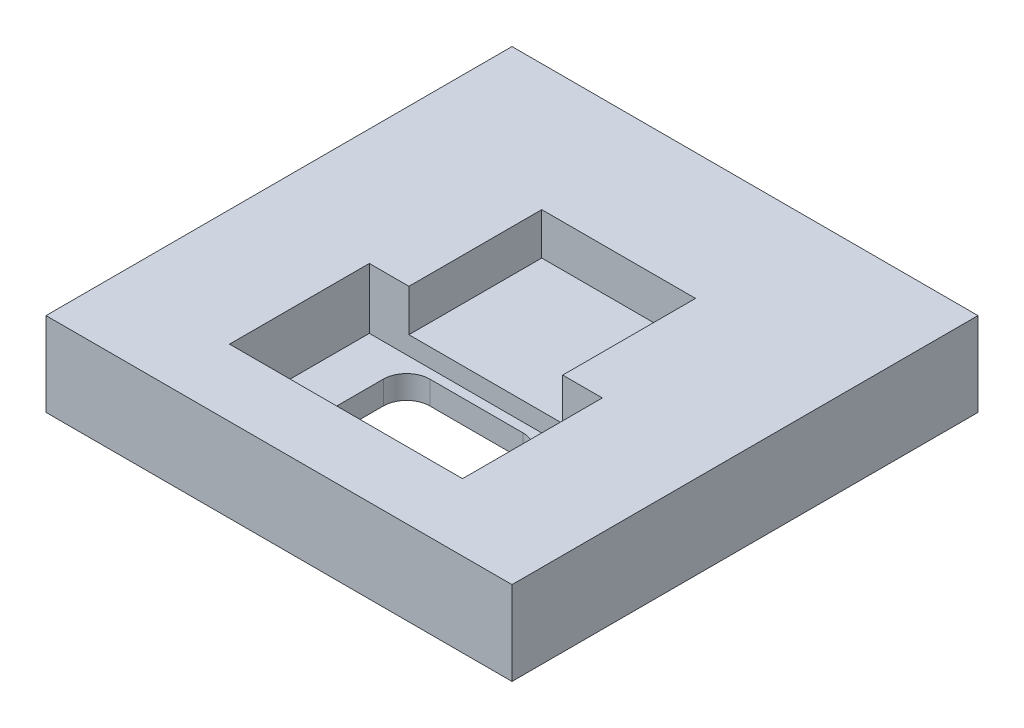
ISO-10303-21;
HEADER;
FILE_DESCRIPTION(('STEP AP214'),'2;1');
FILE_NAME('part.step','',(''),(''),'','','');
FILE_SCHEMA(('AUTOMOTIVE_DESIGN { 1 0 10303 214 1 1 1 1 }'));
ENDSEC;
DATA;
#1=APPLICATION_CONTEXT('core data for automotive mechanical design processes');
#2=APPLICATION_PROTOCOL_DEFINITION('international standard','automotive_design',2000,#1);
#3=PRODUCT_CONTEXT('',#1,'mechanical');
#4=PRODUCT('Part','Part','',(#3));
#5=PRODUCT_RELATED_PRODUCT_CATEGORY('part','',(#4));
#6=PRODUCT_DEFINITION_FORMATION('','',#4);
#7=PRODUCT_DEFINITION_CONTEXT('part definition',#1,'design');
#8=PRODUCT_DEFINITION('design','',#6,#7);
#9=PRODUCT_DEFINITION_SHAPE('','',#8);
#10=(LENGTH_UNIT() NAMED_UNIT(*) SI_UNIT(.MILLI.,.METRE.));
#11=(NAMED_UNIT(*) PLANE_ANGLE_UNIT() SI_UNIT($,.RADIAN.));
#12=(NAMED_UNIT(*) SI_UNIT($,.STERADIAN.) SOLID_ANGLE_UNIT());
#13=UNCERTAINTY_MEASURE_WITH_UNIT(LENGTH_MEASURE(1.E-05),#10,'distance_accuracy_value','');
#14=(GEOMETRIC_REPRESENTATION_CONTEXT(3) GLOBAL_UNCERTAINTY_ASSIGNED_CONTEXT((#13)) GLOBAL_UNIT_ASSIGNED_CONTEXT((#10,
#11,#12)) REPRESENTATION_CONTEXT('',''));
#15=CARTESIAN_POINT('',(0.,0.,0.));
#16=DIRECTION('',(0.,0.,1.));
#17=DIRECTION('',(1.,0.,0.));
#18=AXIS2_PLACEMENT_3D('',#15,#16,#17);
#19=CARTESIAN_POINT('',(-50.,18.,50.));
#20=DIRECTION('',(1.,0.,0.));
#21=DIRECTION('',(0.,0.,-1.));
#22=AXIS2_PLACEMENT_3D('',#19,#20,#21);
#23=PLANE('',#22);
#24=DIRECTION('',(0.,0.,1.));
#25=VECTOR('',#24,1.);
#26=CARTESIAN_POINT('',(-50.,0.,50.));
#27=LINE('',#26,#25);
#28=CARTESIAN_POINT('',(-50.,0.,-50.));
#29=VERTEX_POINT('',#28);
#30=CARTESIAN_POINT('',(-50.,0.,50.));
#31=VERTEX_POINT('',#30);
#32=EDGE_CURVE('E270',#29,#31,#27,.T.);
#33=ORIENTED_EDGE('',*,*,#32,.T.);
#34=DIRECTION('',(0.,-1.,0.));
#35=VECTOR('',#34,1.);
#36=CARTESIAN_POINT('',(-50.,18.,50.));
#37=LINE('',#36,#35);
#38=CARTESIAN_POINT('',(-50.,18.,50.));
#39=VERTEX_POINT('',#38);
#40=EDGE_CURVE('E303',#39,#31,#37,.T.);
#41=ORIENTED_EDGE('',*,*,#40,.F.);
#42=DIRECTION('',(0.,0.,1.));
#43=VECTOR('',#42,1.);
#44=CARTESIAN_POINT('',(-50.,18.,50.));
#45=LINE('',#44,#43);
#46=CARTESIAN_POINT('',(-50.,18.,-50.));
#47=VERTEX_POINT('',#46);
#48=EDGE_CURVE('E277',#47,#39,#45,.T.);
#49=ORIENTED_EDGE('',*,*,#48,.F.);
#50=DIRECTION('',(0.,-1.,0.));
#51=VECTOR('',#50,1.);
#52=CARTESIAN_POINT('',(-50.,18.,-50.));
#53=LINE('',#52,#51);
#54=EDGE_CURVE('E287',#47,#29,#53,.T.);
#55=ORIENTED_EDGE('',*,*,#54,.T.);
#56=EDGE_LOOP('',(#33,#41,#49,#55));
#57=FACE_BOUND('',#56,.T.);
#58=ADVANCED_FACE('F35',(#57),#23,.F.);
#59=CARTESIAN_POINT('',(50.,18.,50.));
#60=DIRECTION('',(0.,0.,-1.));
#61=DIRECTION('',(-1.,0.,0.));
#62=AXIS2_PLACEMENT_3D('',#59,#60,#61);
#63=PLANE('',#62);
#64=DIRECTION('',(1.,0.,0.));
#65=VECTOR('',#64,1.);
#66=CARTESIAN_POINT('',(50.,0.,50.));
#67=LINE('',#66,#65);
#68=CARTESIAN_POINT('',(50.,0.,50.));
#69=VERTEX_POINT('',#68);
#70=EDGE_CURVE('E290',#31,#69,#67,.T.);
#71=ORIENTED_EDGE('',*,*,#70,.T.);
#72=DIRECTION('',(0.,-1.,0.));
#73=VECTOR('',#72,1.);
#74=CARTESIAN_POINT('',(50.,18.,50.));
#75=LINE('',#74,#73);
#76=CARTESIAN_POINT('',(50.,18.,50.));
#77=VERTEX_POINT('',#76);
#78=EDGE_CURVE('E300',#77,#69,#75,.T.);
#79=ORIENTED_EDGE('',*,*,#78,.F.);
#80=DIRECTION('',(1.,0.,0.));
#81=VECTOR('',#80,1.);
#82=CARTESIAN_POINT('',(50.,18.,50.));
#83=LINE('',#82,#81);
#84=EDGE_CURVE('E280',#39,#77,#83,.T.);
#85=ORIENTED_EDGE('',*,*,#84,.F.);
#86=ORIENTED_EDGE('',*,*,#40,.T.);
#87=EDGE_LOOP('',(#71,#79,#85,#86));
#88=FACE_BOUND('',#87,.T.);
#89=ADVANCED_FACE('F366',(#88),#63,.F.);
#90=CARTESIAN_POINT('',(50.,18.,50.));
#91=DIRECTION('',(-1.,0.,0.));
#92=DIRECTION('',(0.,0.,1.));
#93=AXIS2_PLACEMENT_3D('',#90,#91,#92);
#94=PLANE('',#93);
#95=DIRECTION('',(0.,0.,-1.));
#96=VECTOR('',#95,1.);
#97=CARTESIAN_POINT('',(50.,0.,50.));
#98=LINE('',#97,#96);
#99=CARTESIAN_POINT('',(50.,0.,-50.));
#100=VERTEX_POINT('',#99);
#101=EDGE_CURVE('E292',#69,#100,#98,.T.);
#102=ORIENTED_EDGE('',*,*,#101,.T.);
#103=DIRECTION('',(0.,-1.,0.));
#104=VECTOR('',#103,1.);
#105=CARTESIAN_POINT('',(50.,18.,-50.));
#106=LINE('',#105,#104);
#107=CARTESIAN_POINT('',(50.,18.,-50.));
#108=VERTEX_POINT('',#107);
#109=EDGE_CURVE('E297',#108,#100,#106,.T.);
#110=ORIENTED_EDGE('',*,*,#109,.F.);
#111=DIRECTION('',(0.,0.,-1.));
#112=VECTOR('',#111,1.);
#113=CARTESIAN_POINT('',(50.,18.,50.));
#114=LINE('',#113,#112);
#115=EDGE_CURVE('E283',#77,#108,#114,.T.);
#116=ORIENTED_EDGE('',*,*,#115,.F.);
#117=ORIENTED_EDGE('',*,*,#78,.T.);
#118=EDGE_LOOP('',(#102,#110,#116,#117));
#119=FACE_BOUND('',#118,.T.);
#120=ADVANCED_FACE('F371',(#119),#94,.F.);
#121=CARTESIAN_POINT('',(50.,18.,-50.));
#122=DIRECTION('',(0.,0.,1.));
#123=DIRECTION('',(1.,0.,0.));
#124=AXIS2_PLACEMENT_3D('',#121,#122,#123);
#125=PLANE('',#124);
#126=DIRECTION('',(-1.,0.,0.));
#127=VECTOR('',#126,1.);
#128=CARTESIAN_POINT('',(50.,0.,-50.));
#129=LINE('',#128,#127);
#130=EDGE_CURVE('E281',#100,#29,#129,.T.);
#131=ORIENTED_EDGE('',*,*,#130,.T.);
#132=ORIENTED_EDGE('',*,*,#54,.F.);
#133=DIRECTION('',(-1.,0.,0.));
#134=VECTOR('',#133,1.);
#135=CARTESIAN_POINT('',(50.,18.,-50.));
#136=LINE('',#135,#134);
#137=EDGE_CURVE('E285',#108,#47,#136,.T.);
#138=ORIENTED_EDGE('',*,*,#137,.F.);
#139=ORIENTED_EDGE('',*,*,#109,.T.);
#140=EDGE_LOOP('',(#131,#132,#138,#139));
#141=FACE_BOUND('',#140,.T.);
#142=ADVANCED_FACE('F386',(#141),#125,.F.);
#143=CARTESIAN_POINT('',(0.,18.,0.));
#144=DIRECTION('',(0.,1.,0.));
#145=DIRECTION('',(0.,0.,1.));
#146=AXIS2_PLACEMENT_3D('',#143,#144,#145);
#147=PLANE('',#146);
#148=DIRECTION('',(0.,0.,1.));
#149=VECTOR('',#148,1.);
#150=CARTESIAN_POINT('',(-16.5,18.,-22.8834205457136));
#151=LINE('',#150,#149);
#152=CARTESIAN_POINT('',(-16.5,18.,-22.8834205457136));
#153=VERTEX_POINT('',#152);
#154=CARTESIAN_POINT('',(-16.5,18.,5.61657945428637));
#155=VERTEX_POINT('',#154);
#156=EDGE_CURVE('E500',#153,#155,#151,.T.);
#157=ORIENTED_EDGE('',*,*,#156,.F.);
#158=DIRECTION('',(-1.,0.,0.));
#159=VECTOR('',#158,1.);
#160=CARTESIAN_POINT('',(16.5,18.,-22.8834205457136));
#161=LINE('',#160,#159);
#162=CARTESIAN_POINT('',(16.5,18.,-22.8834205457136));
#163=VERTEX_POINT('',#162);
#164=EDGE_CURVE('E495',#163,#153,#161,.T.);
#165=ORIENTED_EDGE('',*,*,#164,.F.);
#166=DIRECTION('',(0.,0.,-1.));
#167=VECTOR('',#166,1.);
#168=CARTESIAN_POINT('',(16.5,18.,-22.8834205457136));
#169=LINE('',#168,#167);
#170=CARTESIAN_POINT('',(16.5,18.,5.61657945428637));
#171=VERTEX_POINT('',#170);
#172=EDGE_CURVE('E497',#171,#163,#169,.T.);
#173=ORIENTED_EDGE('',*,*,#172,.F.);
#174=DIRECTION('',(-1.,0.,0.));
#175=VECTOR('',#174,1.);
#176=CARTESIAN_POINT('',(25.,18.,5.61657945428637));
#177=LINE('',#176,#175);
#178=CARTESIAN_POINT('',(25.,18.,5.61657945428637));
#179=VERTEX_POINT('',#178);
#180=EDGE_CURVE('E192',#179,#171,#177,.T.);
#181=ORIENTED_EDGE('',*,*,#180,.F.);
#182=DIRECTION('',(0.,0.,-1.));
#183=VECTOR('',#182,1.);
#184=CARTESIAN_POINT('',(25.,18.,5.61657945428637));
#185=LINE('',#184,#183);
#186=CARTESIAN_POINT('',(25.,18.,35.6165794542864));
#187=VERTEX_POINT('',#186);
#188=EDGE_CURVE('E262',#187,#179,#185,.T.);
#189=ORIENTED_EDGE('',*,*,#188,.F.);
#190=DIRECTION('',(1.,0.,0.));
#191=VECTOR('',#190,1.);
#192=CARTESIAN_POINT('',(25.,18.,35.6165794542864));
#193=LINE('',#192,#191);
#194=CARTESIAN_POINT('',(-25.,18.,35.6165794542864));
#195=VERTEX_POINT('',#194);
#196=EDGE_CURVE('E259',#195,#187,#193,.T.);
#197=ORIENTED_EDGE('',*,*,#196,.F.);
#198=DIRECTION('',(0.,0.,1.));
#199=VECTOR('',#198,1.);
#200=CARTESIAN_POINT('',(-25.,18.,5.61657945428638));
#201=LINE('',#200,#199);
#202=CARTESIAN_POINT('',(-25.,18.,5.61657945428638));
#203=VERTEX_POINT('',#202);
#204=EDGE_CURVE('E226',#203,#195,#201,.T.);
#205=ORIENTED_EDGE('',*,*,#204,.F.);
#206=EDGE_CURVE('E265',#155,#203,#177,.T.);
#207=ORIENTED_EDGE('',*,*,#206,.F.);
#208=EDGE_LOOP('',(#157,#165,#173,#181,#189,#197,#205,#207));
#209=FACE_BOUND('',#208,.T.);
#210=ORIENTED_EDGE('',*,*,#48,.T.);
#211=ORIENTED_EDGE('',*,*,#84,.T.);
#212=ORIENTED_EDGE('',*,*,#115,.T.);
#213=ORIENTED_EDGE('',*,*,#137,.T.);
#214=EDGE_LOOP('',(#210,#211,#212,#213));
#215=FACE_BOUND('',#214,.T.);
#216=ADVANCED_FACE('F382',(#209,#215),#147,.T.);
#217=CARTESIAN_POINT('',(0.,0.,0.));
#218=DIRECTION('',(0.,1.,0.));
#219=DIRECTION('',(0.,0.,1.));
#220=AXIS2_PLACEMENT_3D('',#217,#218,#219);
#221=PLANE('',#220);
#222=DIRECTION('',(-1.,0.,0.));
#223=VECTOR('',#222,1.);
#224=CARTESIAN_POINT('',(10.,0.,7.61657945428637));
#225=LINE('',#224,#223);
#226=CARTESIAN_POINT('',(10.,0.,7.61657945428637));
#227=VERTEX_POINT('',#226);
#228=CARTESIAN_POINT('',(-9.99999999999998,0.,7.61657945428637));
#229=VERTEX_POINT('',#228);
#230=EDGE_CURVE('E219',#227,#229,#225,.T.);
#231=ORIENTED_EDGE('',*,*,#230,.T.);
#232=CARTESIAN_POINT('',(-9.99999999999998,0.,12.6165794542864));
#233=DIRECTION('',(0.,1.,0.));
#234=DIRECTION('',(0.,0.,1.));
#235=AXIS2_PLACEMENT_3D('',#232,#233,#234);
#236=CIRCLE('',#235,5.);
#237=CARTESIAN_POINT('',(-15.,0.,12.6165794542864));
#238=VERTEX_POINT('',#237);
#239=EDGE_CURVE('E200',#229,#238,#236,.T.);
#240=ORIENTED_EDGE('',*,*,#239,.T.);
#241=DIRECTION('',(0.,0.,1.));
#242=VECTOR('',#241,1.);
#243=CARTESIAN_POINT('',(-15.,0.,26.1165794542864));
#244=LINE('',#243,#242);
#245=CARTESIAN_POINT('',(-15.,0.,26.1165794542864));
#246=VERTEX_POINT('',#245);
#247=EDGE_CURVE('E203',#238,#246,#244,.T.);
#248=ORIENTED_EDGE('',*,*,#247,.T.);
#249=CARTESIAN_POINT('',(-9.99999999999998,0.,26.1165794542864));
#250=DIRECTION('',(0.,1.,0.));
#251=DIRECTION('',(0.,0.,1.));
#252=AXIS2_PLACEMENT_3D('',#249,#250,#251);
#253=CIRCLE('',#252,5.);
#254=CARTESIAN_POINT('',(-9.99999999999998,0.,31.1165794542864));
#255=VERTEX_POINT('',#254);
#256=EDGE_CURVE('E57',#246,#255,#253,.T.);
#257=ORIENTED_EDGE('',*,*,#256,.T.);
#258=DIRECTION('',(1.,0.,0.));
#259=VECTOR('',#258,1.);
#260=CARTESIAN_POINT('',(10.,0.,31.1165794542864));
#261=LINE('',#260,#259);
#262=CARTESIAN_POINT('',(10.,0.,31.1165794542864));
#263=VERTEX_POINT('',#262);
#264=EDGE_CURVE('E207',#255,#263,#261,.T.);
#265=ORIENTED_EDGE('',*,*,#264,.T.);
#266=CARTESIAN_POINT('',(10.,0.,26.1165794542864));
#267=DIRECTION('',(0.,1.,0.));
#268=DIRECTION('',(0.,0.,1.));
#269=AXIS2_PLACEMENT_3D('',#266,#267,#268);
#270=CIRCLE('',#269,5.);
#271=CARTESIAN_POINT('',(15.,0.,26.1165794542864));
#272=VERTEX_POINT('',#271);
#273=EDGE_CURVE('E210',#263,#272,#270,.T.);
#274=ORIENTED_EDGE('',*,*,#273,.T.);
#275=DIRECTION('',(0.,0.,-1.));
#276=VECTOR('',#275,1.);
#277=CARTESIAN_POINT('',(15.,0.,26.1165794542864));
#278=LINE('',#277,#276);
#279=CARTESIAN_POINT('',(15.,0.,12.6165794542864));
#280=VERTEX_POINT('',#279);
#281=EDGE_CURVE('E213',#272,#280,#278,.T.);
#282=ORIENTED_EDGE('',*,*,#281,.T.);
#283=CARTESIAN_POINT('',(10.,0.,12.6165794542864));
#284=DIRECTION('',(0.,1.,0.));
#285=DIRECTION('',(0.,0.,1.));
#286=AXIS2_PLACEMENT_3D('',#283,#284,#285);
#287=CIRCLE('',#286,5.);
#288=EDGE_CURVE('E216',#280,#227,#287,.T.);
#289=ORIENTED_EDGE('',*,*,#288,.T.);
#290=EDGE_LOOP('',(#231,#240,#248,#257,#265,#274,#282,#289));
#291=FACE_BOUND('',#290,.T.);
#292=ORIENTED_EDGE('',*,*,#32,.F.);
#293=ORIENTED_EDGE('',*,*,#130,.F.);
#294=ORIENTED_EDGE('',*,*,#101,.F.);
#295=ORIENTED_EDGE('',*,*,#70,.F.);
#296=EDGE_LOOP('',(#292,#293,#294,#295));
#297=FACE_BOUND('',#296,.T.);
#298=ADVANCED_FACE('F336',(#291,#297),#221,.F.);
#299=CARTESIAN_POINT('',(-25.,5.,5.61657945428638));
#300=DIRECTION('',(-1.,0.,0.));
#301=DIRECTION('',(0.,0.,1.));
#302=AXIS2_PLACEMENT_3D('',#299,#300,#301);
#303=PLANE('',#302);
#304=ORIENTED_EDGE('',*,*,#204,.T.);
#305=DIRECTION('',(0.,1.,0.));
#306=VECTOR('',#305,1.);
#307=CARTESIAN_POINT('',(-25.,5.,35.6165794542864));
#308=LINE('',#307,#306);
#309=CARTESIAN_POINT('',(-25.,5.,35.6165794542864));
#310=VERTEX_POINT('',#309);
#311=EDGE_CURVE('E257',#310,#195,#308,.T.);
#312=ORIENTED_EDGE('',*,*,#311,.F.);
#313=DIRECTION('',(0.,0.,1.));
#314=VECTOR('',#313,1.);
#315=CARTESIAN_POINT('',(-25.,5.,5.61657945428638));
#316=LINE('',#315,#314);
#317=CARTESIAN_POINT('',(-25.,5.,5.61657945428638));
#318=VERTEX_POINT('',#317);
#319=EDGE_CURVE('E245',#318,#310,#316,.T.);
#320=ORIENTED_EDGE('',*,*,#319,.F.);
#321=DIRECTION('',(0.,1.,0.));
#322=VECTOR('',#321,1.);
#323=CARTESIAN_POINT('',(-25.,5.,5.61657945428638));
#324=LINE('',#323,#322);
#325=EDGE_CURVE('E267',#318,#203,#324,.T.);
#326=ORIENTED_EDGE('',*,*,#325,.T.);
#327=EDGE_LOOP('',(#304,#312,#320,#326));
#328=FACE_BOUND('',#327,.T.);
#329=ADVANCED_FACE('F397',(#328),#303,.F.);
#330=CARTESIAN_POINT('',(25.,5.,5.61657945428637));
#331=DIRECTION('',(0.,0.,-1.));
#332=DIRECTION('',(-1.,0.,0.));
#333=AXIS2_PLACEMENT_3D('',#330,#331,#332);
#334=PLANE('',#333);
#335=DIRECTION('',(1.,0.,0.));
#336=VECTOR('',#335,1.);
#337=CARTESIAN_POINT('',(16.5,9.,5.61657945428637));
#338=LINE('',#337,#336);
#339=CARTESIAN_POINT('',(-16.5,9.,5.61657945428637));
#340=VERTEX_POINT('',#339);
#341=CARTESIAN_POINT('',(16.5,9.,5.61657945428637));
#342=VERTEX_POINT('',#341);
#343=EDGE_CURVE('E182',#340,#342,#338,.T.);
#344=ORIENTED_EDGE('',*,*,#343,.F.);
#345=DIRECTION('',(0.,1.,0.));
#346=VECTOR('',#345,1.);
#347=CARTESIAN_POINT('',(-16.5,9.,5.61657945428637));
#348=LINE('',#347,#346);
#349=EDGE_CURVE('E193',#340,#155,#348,.T.);
#350=ORIENTED_EDGE('',*,*,#349,.T.);
#351=ORIENTED_EDGE('',*,*,#206,.T.);
#352=ORIENTED_EDGE('',*,*,#325,.F.);
#353=DIRECTION('',(-1.,0.,0.));
#354=VECTOR('',#353,1.);
#355=CARTESIAN_POINT('',(25.,5.,5.61657945428637));
#356=LINE('',#355,#354);
#357=CARTESIAN_POINT('',(25.,5.,5.61657945428637));
#358=VERTEX_POINT('',#357);
#359=EDGE_CURVE('E254',#358,#318,#356,.T.);
#360=ORIENTED_EDGE('',*,*,#359,.F.);
#361=DIRECTION('',(0.,1.,0.));
#362=VECTOR('',#361,1.);
#363=CARTESIAN_POINT('',(25.,5.,5.61657945428637));
#364=LINE('',#363,#362);
#365=EDGE_CURVE('E271',#358,#179,#364,.T.);
#366=ORIENTED_EDGE('',*,*,#365,.T.);
#367=ORIENTED_EDGE('',*,*,#180,.T.);
#368=DIRECTION('',(0.,1.,0.));
#369=VECTOR('',#368,1.);
#370=CARTESIAN_POINT('',(16.5,9.,5.61657945428637));
#371=LINE('',#370,#369);
#372=EDGE_CURVE('E177',#342,#171,#371,.T.);
#373=ORIENTED_EDGE('',*,*,#372,.F.);
#374=EDGE_LOOP('',(#344,#350,#351,#352,#360,#366,#367,#373));
#375=FACE_BOUND('',#374,.T.);
#376=ADVANCED_FACE('F190',(#375),#334,.F.);
#377=CARTESIAN_POINT('',(25.,5.,5.61657945428637));
#378=DIRECTION('',(1.,0.,0.));
#379=DIRECTION('',(0.,0.,-1.));
#380=AXIS2_PLACEMENT_3D('',#377,#378,#379);
#381=PLANE('',#380);
#382=ORIENTED_EDGE('',*,*,#188,.T.);
#383=ORIENTED_EDGE('',*,*,#365,.F.);
#384=DIRECTION('',(0.,0.,-1.));
#385=VECTOR('',#384,1.);
#386=CARTESIAN_POINT('',(25.,5.,5.61657945428637));
#387=LINE('',#386,#385);
#388=CARTESIAN_POINT('',(25.,5.,35.6165794542864));
#389=VERTEX_POINT('',#388);
#390=EDGE_CURVE('E251',#389,#358,#387,.T.);
#391=ORIENTED_EDGE('',*,*,#390,.F.);
#392=DIRECTION('',(0.,1.,0.));
#393=VECTOR('',#392,1.);
#394=CARTESIAN_POINT('',(25.,5.,35.6165794542864));
#395=LINE('',#394,#393);
#396=EDGE_CURVE('E273',#389,#187,#395,.T.);
#397=ORIENTED_EDGE('',*,*,#396,.T.);
#398=EDGE_LOOP('',(#382,#383,#391,#397));
#399=FACE_BOUND('',#398,.T.);
#400=ADVANCED_FACE('F407',(#399),#381,.F.);
#401=CARTESIAN_POINT('',(25.,5.,35.6165794542864));
#402=DIRECTION('',(0.,0.,1.));
#403=DIRECTION('',(1.,0.,0.));
#404=AXIS2_PLACEMENT_3D('',#401,#402,#403);
#405=PLANE('',#404);
#406=ORIENTED_EDGE('',*,*,#196,.T.);
#407=ORIENTED_EDGE('',*,*,#396,.F.);
#408=DIRECTION('',(1.,0.,0.));
#409=VECTOR('',#408,1.);
#410=CARTESIAN_POINT('',(25.,5.,35.6165794542864));
#411=LINE('',#410,#409);
#412=EDGE_CURVE('E248',#310,#389,#411,.T.);
#413=ORIENTED_EDGE('',*,*,#412,.F.);
#414=ORIENTED_EDGE('',*,*,#311,.T.);
#415=EDGE_LOOP('',(#406,#407,#413,#414));
#416=FACE_BOUND('',#415,.T.);
#417=ADVANCED_FACE('F404',(#416),#405,.F.);
#418=CARTESIAN_POINT('',(0.,5.,0.));
#419=DIRECTION('',(0.,-1.,0.));
#420=DIRECTION('',(0.,0.,-1.));
#421=AXIS2_PLACEMENT_3D('',#418,#419,#420);
#422=PLANE('',#421);
#423=DIRECTION('',(0.,0.,-1.));
#424=VECTOR('',#423,1.);
#425=CARTESIAN_POINT('',(-15.,5.,0.));
#426=LINE('',#425,#424);
#427=CARTESIAN_POINT('',(-15.,5.,26.1165794542864));
#428=VERTEX_POINT('',#427);
#429=CARTESIAN_POINT('',(-15.,5.,12.6165794542864));
#430=VERTEX_POINT('',#429);
#431=EDGE_CURVE('E306',#428,#430,#426,.T.);
#432=ORIENTED_EDGE('',*,*,#431,.T.);
#433=CARTESIAN_POINT('',(-9.99999999999998,5.,12.6165794542864));
#434=DIRECTION('',(0.,-1.,0.));
#435=DIRECTION('',(0.,0.,-1.));
#436=AXIS2_PLACEMENT_3D('',#433,#434,#435);
#437=CIRCLE('',#436,5.);
#438=CARTESIAN_POINT('',(-9.99999999999998,5.,7.61657945428637));
#439=VERTEX_POINT('',#438);
#440=EDGE_CURVE('E11',#430,#439,#437,.T.);
#441=ORIENTED_EDGE('',*,*,#440,.T.);
#442=DIRECTION('',(1.,0.,0.));
#443=VECTOR('',#442,1.);
#444=CARTESIAN_POINT('',(0.,5.,7.61657945428637));
#445=LINE('',#444,#443);
#446=CARTESIAN_POINT('',(10.,5.,7.61657945428637));
#447=VERTEX_POINT('',#446);
#448=EDGE_CURVE('E42',#439,#447,#445,.T.);
#449=ORIENTED_EDGE('',*,*,#448,.T.);
#450=CARTESIAN_POINT('',(10.,5.,12.6165794542864));
#451=DIRECTION('',(0.,-1.,0.));
#452=DIRECTION('',(0.,0.,-1.));
#453=AXIS2_PLACEMENT_3D('',#450,#451,#452);
#454=CIRCLE('',#453,5.);
#455=CARTESIAN_POINT('',(15.,5.,12.6165794542864));
#456=VERTEX_POINT('',#455);
#457=EDGE_CURVE('E321',#447,#456,#454,.T.);
#458=ORIENTED_EDGE('',*,*,#457,.T.);
#459=DIRECTION('',(0.,0.,1.));
#460=VECTOR('',#459,1.);
#461=CARTESIAN_POINT('',(15.,5.,0.));
#462=LINE('',#461,#460);
#463=CARTESIAN_POINT('',(15.,5.,26.1165794542864));
#464=VERTEX_POINT('',#463);
#465=EDGE_CURVE('E318',#456,#464,#462,.T.);
#466=ORIENTED_EDGE('',*,*,#465,.T.);
#467=CARTESIAN_POINT('',(10.,5.,26.1165794542864));
#468=DIRECTION('',(0.,-1.,0.));
#469=DIRECTION('',(0.,0.,-1.));
#470=AXIS2_PLACEMENT_3D('',#467,#468,#469);
#471=CIRCLE('',#470,5.);
#472=CARTESIAN_POINT('',(10.,5.,31.1165794542864));
#473=VERTEX_POINT('',#472);
#474=EDGE_CURVE('E315',#464,#473,#471,.T.);
#475=ORIENTED_EDGE('',*,*,#474,.T.);
#476=DIRECTION('',(-1.,0.,0.));
#477=VECTOR('',#476,1.);
#478=CARTESIAN_POINT('',(0.,5.,31.1165794542864));
#479=LINE('',#478,#477);
#480=CARTESIAN_POINT('',(-9.99999999999998,5.,31.1165794542864));
#481=VERTEX_POINT('',#480);
#482=EDGE_CURVE('E312',#473,#481,#479,.T.);
#483=ORIENTED_EDGE('',*,*,#482,.T.);
#484=CARTESIAN_POINT('',(-9.99999999999998,5.,26.1165794542864));
#485=DIRECTION('',(0.,-1.,0.));
#486=DIRECTION('',(0.,0.,-1.));
#487=AXIS2_PLACEMENT_3D('',#484,#485,#486);
#488=CIRCLE('',#487,5.);
#489=EDGE_CURVE('E309',#481,#428,#488,.T.);
#490=ORIENTED_EDGE('',*,*,#489,.T.);
#491=EDGE_LOOP('',(#432,#441,#449,#458,#466,#475,#483,#490));
#492=FACE_BOUND('',#491,.T.);
#493=ORIENTED_EDGE('',*,*,#319,.T.);
#494=ORIENTED_EDGE('',*,*,#412,.T.);
#495=ORIENTED_EDGE('',*,*,#390,.T.);
#496=ORIENTED_EDGE('',*,*,#359,.T.);
#497=EDGE_LOOP('',(#493,#494,#495,#496));
#498=FACE_BOUND('',#497,.T.);
#499=ADVANCED_FACE('F325',(#492,#498),#422,.F.);
#500=CARTESIAN_POINT('',(-9.99999999999998,0.,12.6165794542864));
#501=DIRECTION('',(0.,1.,0.));
#502=DIRECTION('',(0.,0.,1.));
#503=AXIS2_PLACEMENT_3D('',#500,#501,#502);
#504=CYLINDRICAL_SURFACE('',#503,5.);
#505=DIRECTION('',(0.,1.,0.));
#506=VECTOR('',#505,1.);
#507=CARTESIAN_POINT('',(-15.,0.,12.6165794542864));
#508=LINE('',#507,#506);
#509=EDGE_CURVE('E222',#238,#430,#508,.T.);
#510=ORIENTED_EDGE('',*,*,#509,.F.);
#511=ORIENTED_EDGE('',*,*,#239,.F.);
#512=DIRECTION('',(0.,1.,0.));
#513=VECTOR('',#512,1.);
#514=CARTESIAN_POINT('',(-9.99999999999998,0.,7.61657945428637));
#515=LINE('',#514,#513);
#516=EDGE_CURVE('E223',#229,#439,#515,.T.);
#517=ORIENTED_EDGE('',*,*,#516,.T.);
#518=ORIENTED_EDGE('',*,*,#440,.F.);
#519=EDGE_LOOP('',(#510,#511,#517,#518));
#520=FACE_BOUND('',#519,.T.);
#521=ADVANCED_FACE('F333',(#520),#504,.F.);
#522=CARTESIAN_POINT('',(10.,0.,7.61657945428637));
#523=DIRECTION('',(0.,0.,-1.));
#524=DIRECTION('',(-1.,0.,0.));
#525=AXIS2_PLACEMENT_3D('',#522,#523,#524);
#526=PLANE('',#525);
#527=ORIENTED_EDGE('',*,*,#516,.F.);
#528=ORIENTED_EDGE('',*,*,#230,.F.);
#529=DIRECTION('',(0.,1.,0.));
#530=VECTOR('',#529,1.);
#531=CARTESIAN_POINT('',(10.,0.,7.61657945428637));
#532=LINE('',#531,#530);
#533=EDGE_CURVE('E227',#227,#447,#532,.T.);
#534=ORIENTED_EDGE('',*,*,#533,.T.);
#535=ORIENTED_EDGE('',*,*,#448,.F.);
#536=EDGE_LOOP('',(#527,#528,#534,#535));
#537=FACE_BOUND('',#536,.T.);
#538=ADVANCED_FACE('F329',(#537),#526,.F.);
#539=CARTESIAN_POINT('',(10.,0.,12.6165794542864));
#540=DIRECTION('',(0.,1.,0.));
#541=DIRECTION('',(0.,0.,1.));
#542=AXIS2_PLACEMENT_3D('',#539,#540,#541);
#543=CYLINDRICAL_SURFACE('',#542,5.);
#544=ORIENTED_EDGE('',*,*,#533,.F.);
#545=ORIENTED_EDGE('',*,*,#288,.F.);
#546=DIRECTION('',(0.,1.,0.));
#547=VECTOR('',#546,1.);
#548=CARTESIAN_POINT('',(15.,0.,12.6165794542864));
#549=LINE('',#548,#547);
#550=EDGE_CURVE('E230',#280,#456,#549,.T.);
#551=ORIENTED_EDGE('',*,*,#550,.T.);
#552=ORIENTED_EDGE('',*,*,#457,.F.);
#553=EDGE_LOOP('',(#544,#545,#551,#552));
#554=FACE_BOUND('',#553,.T.);
#555=ADVANCED_FACE('F341',(#554),#543,.F.);
#556=CARTESIAN_POINT('',(15.,0.,26.1165794542864));
#557=DIRECTION('',(1.,0.,0.));
#558=DIRECTION('',(0.,0.,-1.));
#559=AXIS2_PLACEMENT_3D('',#556,#557,#558);
#560=PLANE('',#559);
#561=ORIENTED_EDGE('',*,*,#550,.F.);
#562=ORIENTED_EDGE('',*,*,#281,.F.);
#563=DIRECTION('',(0.,1.,0.));
#564=VECTOR('',#563,1.);
#565=CARTESIAN_POINT('',(15.,0.,26.1165794542864));
#566=LINE('',#565,#564);
#567=EDGE_CURVE('E233',#272,#464,#566,.T.);
#568=ORIENTED_EDGE('',*,*,#567,.T.);
#569=ORIENTED_EDGE('',*,*,#465,.F.);
#570=EDGE_LOOP('',(#561,#562,#568,#569));
#571=FACE_BOUND('',#570,.T.);
#572=ADVANCED_FACE('F343',(#571),#560,.F.);
#573=CARTESIAN_POINT('',(10.,0.,26.1165794542864));
#574=DIRECTION('',(0.,1.,0.));
#575=DIRECTION('',(0.,0.,1.));
#576=AXIS2_PLACEMENT_3D('',#573,#574,#575);
#577=CYLINDRICAL_SURFACE('',#576,5.);
#578=ORIENTED_EDGE('',*,*,#567,.F.);
#579=ORIENTED_EDGE('',*,*,#273,.F.);
#580=DIRECTION('',(0.,1.,0.));
#581=VECTOR('',#580,1.);
#582=CARTESIAN_POINT('',(10.,0.,31.1165794542864));
#583=LINE('',#582,#581);
#584=EDGE_CURVE('E236',#263,#473,#583,.T.);
#585=ORIENTED_EDGE('',*,*,#584,.T.);
#586=ORIENTED_EDGE('',*,*,#474,.F.);
#587=EDGE_LOOP('',(#578,#579,#585,#586));
#588=FACE_BOUND('',#587,.T.);
#589=ADVANCED_FACE('F345',(#588),#577,.F.);
#590=CARTESIAN_POINT('',(10.,0.,31.1165794542864));
#591=DIRECTION('',(0.,0.,1.));
#592=DIRECTION('',(1.,0.,0.));
#593=AXIS2_PLACEMENT_3D('',#590,#591,#592);
#594=PLANE('',#593);
#595=ORIENTED_EDGE('',*,*,#584,.F.);
#596=ORIENTED_EDGE('',*,*,#264,.F.);
#597=DIRECTION('',(0.,1.,0.));
#598=VECTOR('',#597,1.);
#599=CARTESIAN_POINT('',(-9.99999999999998,0.,31.1165794542864));
#600=LINE('',#599,#598);
#601=EDGE_CURVE('E239',#255,#481,#600,.T.);
#602=ORIENTED_EDGE('',*,*,#601,.T.);
#603=ORIENTED_EDGE('',*,*,#482,.F.);
#604=EDGE_LOOP('',(#595,#596,#602,#603));
#605=FACE_BOUND('',#604,.T.);
#606=ADVANCED_FACE('F349',(#605),#594,.F.);
#607=CARTESIAN_POINT('',(-9.99999999999998,0.,26.1165794542864));
#608=DIRECTION('',(0.,1.,0.));
#609=DIRECTION('',(0.,0.,1.));
#610=AXIS2_PLACEMENT_3D('',#607,#608,#609);
#611=CYLINDRICAL_SURFACE('',#610,5.);
#612=ORIENTED_EDGE('',*,*,#601,.F.);
#613=ORIENTED_EDGE('',*,*,#256,.F.);
#614=DIRECTION('',(0.,1.,0.));
#615=VECTOR('',#614,1.);
#616=CARTESIAN_POINT('',(-15.,0.,26.1165794542864));
#617=LINE('',#616,#615);
#618=EDGE_CURVE('E242',#246,#428,#617,.T.);
#619=ORIENTED_EDGE('',*,*,#618,.T.);
#620=ORIENTED_EDGE('',*,*,#489,.F.);
#621=EDGE_LOOP('',(#612,#613,#619,#620));
#622=FACE_BOUND('',#621,.T.);
#623=ADVANCED_FACE('F350',(#622),#611,.F.);
#624=CARTESIAN_POINT('',(-15.,0.,26.1165794542864));
#625=DIRECTION('',(-1.,0.,0.));
#626=DIRECTION('',(0.,0.,1.));
#627=AXIS2_PLACEMENT_3D('',#624,#625,#626);
#628=PLANE('',#627);
#629=ORIENTED_EDGE('',*,*,#618,.F.);
#630=ORIENTED_EDGE('',*,*,#247,.F.);
#631=ORIENTED_EDGE('',*,*,#509,.T.);
#632=ORIENTED_EDGE('',*,*,#431,.F.);
#633=EDGE_LOOP('',(#629,#630,#631,#632));
#634=FACE_BOUND('',#633,.T.);
#635=ADVANCED_FACE('F352',(#634),#628,.F.);
#636=CARTESIAN_POINT('',(-16.5,9.,-22.8834205457136));
#637=DIRECTION('',(-1.,0.,0.));
#638=DIRECTION('',(0.,0.,1.));
#639=AXIS2_PLACEMENT_3D('',#636,#637,#638);
#640=PLANE('',#639);
#641=ORIENTED_EDGE('',*,*,#156,.T.);
#642=ORIENTED_EDGE('',*,*,#349,.F.);
#643=DIRECTION('',(0.,0.,1.));
#644=VECTOR('',#643,1.);
#645=CARTESIAN_POINT('',(-16.5,9.,-22.8834205457136));
#646=LINE('',#645,#644);
#647=CARTESIAN_POINT('',(-16.5,9.,-22.8834205457136));
#648=VERTEX_POINT('',#647);
#649=EDGE_CURVE('E49',#648,#340,#646,.T.);
#650=ORIENTED_EDGE('',*,*,#649,.F.);
#651=DIRECTION('',(0.,1.,0.));
#652=VECTOR('',#651,1.);
#653=CARTESIAN_POINT('',(-16.5,9.,-22.8834205457136));
#654=LINE('',#653,#652);
#655=EDGE_CURVE('E195',#648,#153,#654,.T.);
#656=ORIENTED_EDGE('',*,*,#655,.T.);
#657=EDGE_LOOP('',(#641,#642,#650,#656));
#658=FACE_BOUND('',#657,.T.);
#659=ADVANCED_FACE('F354',(#658),#640,.F.);
#660=CARTESIAN_POINT('',(16.5,9.,-22.8834205457136));
#661=DIRECTION('',(0.,0.,-1.));
#662=DIRECTION('',(-1.,0.,0.));
#663=AXIS2_PLACEMENT_3D('',#660,#661,#662);
#664=PLANE('',#663);
#665=ORIENTED_EDGE('',*,*,#164,.T.);
#666=ORIENTED_EDGE('',*,*,#655,.F.);
#667=DIRECTION('',(-1.,0.,0.));
#668=VECTOR('',#667,1.);
#669=CARTESIAN_POINT('',(16.5,9.,-22.8834205457136));
#670=LINE('',#669,#668);
#671=CARTESIAN_POINT('',(16.5,9.,-22.8834205457136));
#672=VERTEX_POINT('',#671);
#673=EDGE_CURVE('E181',#672,#648,#670,.T.);
#674=ORIENTED_EDGE('',*,*,#673,.F.);
#675=DIRECTION('',(0.,1.,0.));
#676=VECTOR('',#675,1.);
#677=CARTESIAN_POINT('',(16.5,9.,-22.8834205457136));
#678=LINE('',#677,#676);
#679=EDGE_CURVE('E179',#672,#163,#678,.T.);
#680=ORIENTED_EDGE('',*,*,#679,.T.);
#681=EDGE_LOOP('',(#665,#666,#674,#680));
#682=FACE_BOUND('',#681,.T.);
#683=ADVANCED_FACE('F360',(#682),#664,.F.);
#684=CARTESIAN_POINT('',(16.5,9.,-22.8834205457136));
#685=DIRECTION('',(1.,0.,0.));
#686=DIRECTION('',(0.,0.,-1.));
#687=AXIS2_PLACEMENT_3D('',#684,#685,#686);
#688=PLANE('',#687);
#689=ORIENTED_EDGE('',*,*,#172,.T.);
#690=ORIENTED_EDGE('',*,*,#679,.F.);
#691=DIRECTION('',(0.,0.,-1.));
#692=VECTOR('',#691,1.);
#693=CARTESIAN_POINT('',(16.5,9.,-22.8834205457136));
#694=LINE('',#693,#692);
#695=EDGE_CURVE('E173',#342,#672,#694,.T.);
#696=ORIENTED_EDGE('',*,*,#695,.F.);
#697=ORIENTED_EDGE('',*,*,#372,.T.);
#698=EDGE_LOOP('',(#689,#690,#696,#697));
#699=FACE_BOUND('',#698,.T.);
#700=ADVANCED_FACE('F175',(#699),#688,.F.);
#701=CARTESIAN_POINT('',(0.,9.,0.));
#702=DIRECTION('',(0.,-1.,0.));
#703=DIRECTION('',(0.,0.,-1.));
#704=AXIS2_PLACEMENT_3D('',#701,#702,#703);
#705=PLANE('',#704);
#706=ORIENTED_EDGE('',*,*,#649,.T.);
#707=ORIENTED_EDGE('',*,*,#343,.T.);
#708=ORIENTED_EDGE('',*,*,#695,.T.);
#709=ORIENTED_EDGE('',*,*,#673,.T.);
#710=EDGE_LOOP('',(#706,#707,#708,#709));
#711=FACE_BOUND('',#710,.T.);
#712=ADVANCED_FACE('F185',(#711),#705,.F.);
#713=CLOSED_SHELL('',(#58,#89,#120,#142,#216,#298,#329,#376,#400,#417,#499,#521,#538,#555,#572,
#589,#606,#623,#635,#659,#683,#700,#712));
#714=MANIFOLD_SOLID_BREP('B2',#713);
#715=ADVANCED_BREP_SHAPE_REPRESENTATION('',(#18,#714),#14);
#716=SHAPE_DEFINITION_REPRESENTATION(#9,#715);
ENDSEC;
END-ISO-10303-21;
